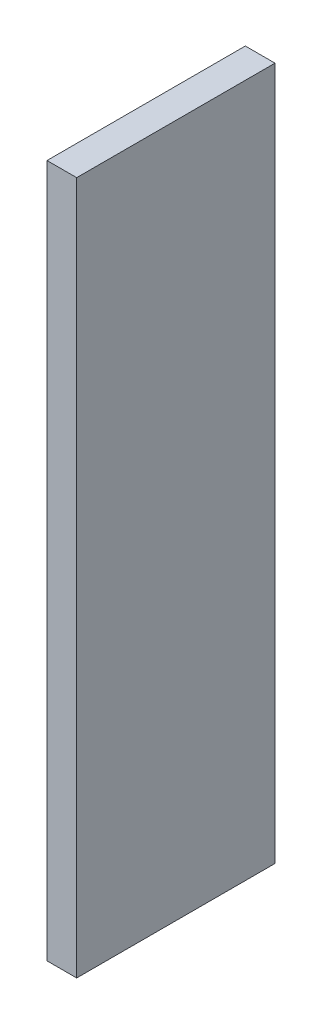
ISO-10303-21;
HEADER;
FILE_DESCRIPTION(('STEP AP214'),'2;1');
FILE_NAME('part.step','',(''),(''),'','','');
FILE_SCHEMA(('AUTOMOTIVE_DESIGN { 1 0 10303 214 1 1 1 1 }'));
ENDSEC;
DATA;
#1=APPLICATION_CONTEXT('core data for automotive mechanical design processes');
#2=APPLICATION_PROTOCOL_DEFINITION('international standard','automotive_design',2000,#1);
#3=PRODUCT_CONTEXT('',#1,'mechanical');
#4=PRODUCT('Part','Part','',(#3));
#5=PRODUCT_RELATED_PRODUCT_CATEGORY('part','',(#4));
#6=PRODUCT_DEFINITION_FORMATION('','',#4);
#7=PRODUCT_DEFINITION_CONTEXT('part definition',#1,'design');
#8=PRODUCT_DEFINITION('design','',#6,#7);
#9=PRODUCT_DEFINITION_SHAPE('','',#8);
#10=(LENGTH_UNIT() NAMED_UNIT(*) SI_UNIT(.MILLI.,.METRE.));
#11=(NAMED_UNIT(*) PLANE_ANGLE_UNIT() SI_UNIT($,.RADIAN.));
#12=(NAMED_UNIT(*) SI_UNIT($,.STERADIAN.) SOLID_ANGLE_UNIT());
#13=UNCERTAINTY_MEASURE_WITH_UNIT(LENGTH_MEASURE(1.E-05),#10,'distance_accuracy_value','');
#14=(GEOMETRIC_REPRESENTATION_CONTEXT(3) GLOBAL_UNCERTAINTY_ASSIGNED_CONTEXT((#13)) GLOBAL_UNIT_ASSIGNED_CONTEXT((#10,
#11,#12)) REPRESENTATION_CONTEXT('',''));
#15=CARTESIAN_POINT('',(0.,0.,0.));
#16=DIRECTION('',(0.,0.,1.));
#17=DIRECTION('',(1.,0.,0.));
#18=AXIS2_PLACEMENT_3D('',#15,#16,#17);
#19=CARTESIAN_POINT('',(3.,0.,0.));
#20=DIRECTION('',(0.,0.,-1.));
#21=DIRECTION('',(-1.,0.,0.));
#22=AXIS2_PLACEMENT_3D('',#19,#20,#21);
#23=PLANE('',#22);
#24=DIRECTION('',(0.,-1.,0.));
#25=VECTOR('',#24,1.);
#26=CARTESIAN_POINT('',(0.,0.,0.));
#27=LINE('',#26,#25);
#28=CARTESIAN_POINT('',(0.,70.0425461639789,0.));
#29=VERTEX_POINT('',#28);
#30=CARTESIAN_POINT('',(0.,0.,0.));
#31=VERTEX_POINT('',#30);
#32=EDGE_CURVE('E107',#29,#31,#27,.T.);
#33=ORIENTED_EDGE('',*,*,#32,.T.);
#34=DIRECTION('',(-1.,0.,0.));
#35=VECTOR('',#34,1.);
#36=CARTESIAN_POINT('',(3.,0.,0.));
#37=LINE('',#36,#35);
#38=CARTESIAN_POINT('',(3.,0.,0.));
#39=VERTEX_POINT('',#38);
#40=EDGE_CURVE('E11',#39,#31,#37,.T.);
#41=ORIENTED_EDGE('',*,*,#40,.F.);
#42=DIRECTION('',(0.,-1.,0.));
#43=VECTOR('',#42,1.);
#44=CARTESIAN_POINT('',(3.,0.,0.));
#45=LINE('',#44,#43);
#46=CARTESIAN_POINT('',(3.,70.0425461639789,0.));
#47=VERTEX_POINT('',#46);
#48=EDGE_CURVE('E90',#47,#39,#45,.T.);
#49=ORIENTED_EDGE('',*,*,#48,.F.);
#50=DIRECTION('',(-1.,0.,0.));
#51=VECTOR('',#50,1.);
#52=CARTESIAN_POINT('',(3.,70.0425461639789,0.));
#53=LINE('',#52,#51);
#54=EDGE_CURVE('E103',#47,#29,#53,.T.);
#55=ORIENTED_EDGE('',*,*,#54,.T.);
#56=EDGE_LOOP('',(#33,#41,#49,#55));
#57=FACE_BOUND('',#56,.T.);
#58=ADVANCED_FACE('F39',(#57),#23,.F.);
#59=CARTESIAN_POINT('',(3.,0.,0.));
#60=DIRECTION('',(0.,1.,0.));
#61=DIRECTION('',(0.,0.,1.));
#62=AXIS2_PLACEMENT_3D('',#59,#60,#61);
#63=PLANE('',#62);
#64=DIRECTION('',(0.,0.,-1.));
#65=VECTOR('',#64,1.);
#66=CARTESIAN_POINT('',(0.,0.,0.));
#67=LINE('',#66,#65);
#68=CARTESIAN_POINT('',(0.,0.,-20.0425461639789));
#69=VERTEX_POINT('',#68);
#70=EDGE_CURVE('E96',#31,#69,#67,.T.);
#71=ORIENTED_EDGE('',*,*,#70,.T.);
#72=DIRECTION('',(-1.,0.,0.));
#73=VECTOR('',#72,1.);
#74=CARTESIAN_POINT('',(3.,0.,-20.0425461639789));
#75=LINE('',#74,#73);
#76=CARTESIAN_POINT('',(3.,0.,-20.0425461639789));
#77=VERTEX_POINT('',#76);
#78=EDGE_CURVE('E48',#77,#69,#75,.T.);
#79=ORIENTED_EDGE('',*,*,#78,.F.);
#80=DIRECTION('',(0.,0.,-1.));
#81=VECTOR('',#80,1.);
#82=CARTESIAN_POINT('',(3.,0.,0.));
#83=LINE('',#82,#81);
#84=EDGE_CURVE('E85',#39,#77,#83,.T.);
#85=ORIENTED_EDGE('',*,*,#84,.F.);
#86=ORIENTED_EDGE('',*,*,#40,.T.);
#87=EDGE_LOOP('',(#71,#79,#85,#86));
#88=FACE_BOUND('',#87,.T.);
#89=ADVANCED_FACE('F95',(#88),#63,.F.);
#90=CARTESIAN_POINT('',(3.,6.46392539310834,-20.0425461639789));
#91=DIRECTION('',(0.,0.,1.));
#92=DIRECTION('',(0.,-1.,0.));
#93=AXIS2_PLACEMENT_3D('',#90,#91,#92);
#94=PLANE('',#93);
#95=DIRECTION('',(0.,1.,0.));
#96=VECTOR('',#95,1.);
#97=CARTESIAN_POINT('',(0.,6.46392539310834,-20.0425461639789));
#98=LINE('',#97,#96);
#99=CARTESIAN_POINT('',(0.,70.0425461639789,-20.0425461639789));
#100=VERTEX_POINT('',#99);
#101=EDGE_CURVE('E72',#69,#100,#98,.T.);
#102=ORIENTED_EDGE('',*,*,#101,.T.);
#103=DIRECTION('',(-1.,0.,0.));
#104=VECTOR('',#103,1.);
#105=CARTESIAN_POINT('',(3.,70.0425461639789,-20.0425461639789));
#106=LINE('',#105,#104);
#107=CARTESIAN_POINT('',(3.,70.0425461639789,-20.0425461639789));
#108=VERTEX_POINT('',#107);
#109=EDGE_CURVE('E98',#108,#100,#106,.T.);
#110=ORIENTED_EDGE('',*,*,#109,.F.);
#111=DIRECTION('',(0.,1.,0.));
#112=VECTOR('',#111,1.);
#113=CARTESIAN_POINT('',(3.,0.,-20.0425461639789));
#114=LINE('',#113,#112);
#115=EDGE_CURVE('E88',#77,#108,#114,.T.);
#116=ORIENTED_EDGE('',*,*,#115,.F.);
#117=ORIENTED_EDGE('',*,*,#78,.T.);
#118=EDGE_LOOP('',(#102,#110,#116,#117));
#119=FACE_BOUND('',#118,.T.);
#120=ADVANCED_FACE('F99',(#119),#94,.F.);
#121=CARTESIAN_POINT('',(3.,70.0425461639789,0.));
#122=DIRECTION('',(0.,-1.,0.));
#123=DIRECTION('',(0.,0.,-1.));
#124=AXIS2_PLACEMENT_3D('',#121,#122,#123);
#125=PLANE('',#124);
#126=DIRECTION('',(0.,0.,1.));
#127=VECTOR('',#126,1.);
#128=CARTESIAN_POINT('',(0.,70.0425461639789,0.));
#129=LINE('',#128,#127);
#130=EDGE_CURVE('E78',#100,#29,#129,.T.);
#131=ORIENTED_EDGE('',*,*,#130,.T.);
#132=ORIENTED_EDGE('',*,*,#54,.F.);
#133=DIRECTION('',(0.,0.,1.));
#134=VECTOR('',#133,1.);
#135=CARTESIAN_POINT('',(3.,70.0425461639789,0.));
#136=LINE('',#135,#134);
#137=EDGE_CURVE('E56',#108,#47,#136,.T.);
#138=ORIENTED_EDGE('',*,*,#137,.F.);
#139=ORIENTED_EDGE('',*,*,#109,.T.);
#140=EDGE_LOOP('',(#131,#132,#138,#139));
#141=FACE_BOUND('',#140,.T.);
#142=ADVANCED_FACE('F120',(#141),#125,.F.);
#143=CARTESIAN_POINT('',(3.,0.,0.));
#144=DIRECTION('',(-1.,0.,0.));
#145=DIRECTION('',(0.,0.,1.));
#146=AXIS2_PLACEMENT_3D('',#143,#144,#145);
#147=PLANE('',#146);
#148=ORIENTED_EDGE('',*,*,#48,.T.);
#149=ORIENTED_EDGE('',*,*,#84,.T.);
#150=ORIENTED_EDGE('',*,*,#115,.T.);
#151=ORIENTED_EDGE('',*,*,#137,.T.);
#152=EDGE_LOOP('',(#148,#149,#150,#151));
#153=FACE_BOUND('',#152,.T.);
#154=ADVANCED_FACE('F86',(#153),#147,.F.);
#155=CARTESIAN_POINT('',(0.,0.,0.));
#156=DIRECTION('',(-1.,0.,0.));
#157=DIRECTION('',(0.,0.,1.));
#158=AXIS2_PLACEMENT_3D('',#155,#156,#157);
#159=PLANE('',#158);
#160=ORIENTED_EDGE('',*,*,#32,.F.);
#161=ORIENTED_EDGE('',*,*,#130,.F.);
#162=ORIENTED_EDGE('',*,*,#101,.F.);
#163=ORIENTED_EDGE('',*,*,#70,.F.);
#164=EDGE_LOOP('',(#160,#161,#162,#163));
#165=FACE_BOUND('',#164,.T.);
#166=ADVANCED_FACE('F123',(#165),#159,.T.);
#167=CLOSED_SHELL('',(#58,#89,#120,#142,#154,#166));
#168=MANIFOLD_SOLID_BREP('B2',#167);
#169=ADVANCED_BREP_SHAPE_REPRESENTATION('',(#18,#168),#14);
#170=SHAPE_DEFINITION_REPRESENTATION(#9,#169);
ENDSEC;
END-ISO-10303-21;
